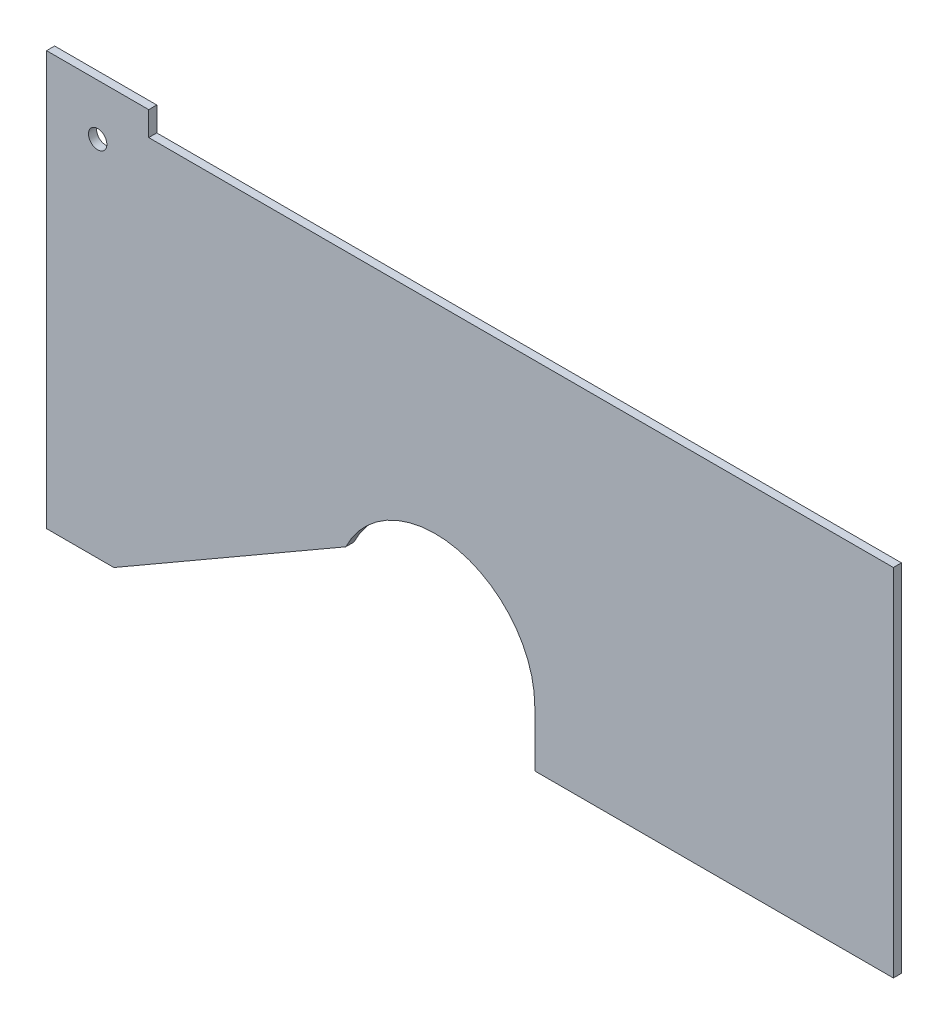
ISO-10303-21;
HEADER;
FILE_DESCRIPTION(('STEP AP214'),'2;1');
FILE_NAME('part.step','',(''),(''),'','','');
FILE_SCHEMA(('AUTOMOTIVE_DESIGN { 1 0 10303 214 1 1 1 1 }'));
ENDSEC;
DATA;
#1=APPLICATION_CONTEXT('core data for automotive mechanical design processes');
#2=APPLICATION_PROTOCOL_DEFINITION('international standard','automotive_design',2000,#1);
#3=PRODUCT_CONTEXT('',#1,'mechanical');
#4=PRODUCT('Part','Part','',(#3));
#5=PRODUCT_RELATED_PRODUCT_CATEGORY('part','',(#4));
#6=PRODUCT_DEFINITION_FORMATION('','',#4);
#7=PRODUCT_DEFINITION_CONTEXT('part definition',#1,'design');
#8=PRODUCT_DEFINITION('design','',#6,#7);
#9=PRODUCT_DEFINITION_SHAPE('','',#8);
#10=(LENGTH_UNIT() NAMED_UNIT(*) SI_UNIT(.MILLI.,.METRE.));
#11=(NAMED_UNIT(*) PLANE_ANGLE_UNIT() SI_UNIT($,.RADIAN.));
#12=(NAMED_UNIT(*) SI_UNIT($,.STERADIAN.) SOLID_ANGLE_UNIT());
#13=UNCERTAINTY_MEASURE_WITH_UNIT(LENGTH_MEASURE(1.E-05),#10,'distance_accuracy_value','');
#14=(GEOMETRIC_REPRESENTATION_CONTEXT(3) GLOBAL_UNCERTAINTY_ASSIGNED_CONTEXT((#13)) GLOBAL_UNIT_ASSIGNED_CONTEXT((#10,
#11,#12)) REPRESENTATION_CONTEXT('',''));
#15=CARTESIAN_POINT('',(0.,0.,0.));
#16=DIRECTION('',(0.,0.,1.));
#17=DIRECTION('',(1.,0.,0.));
#18=AXIS2_PLACEMENT_3D('',#15,#16,#17);
#19=CARTESIAN_POINT('',(144.6,33.7,3.));
#20=DIRECTION('',(0.,0.,1.));
#21=DIRECTION('',(1.,0.,0.));
#22=AXIS2_PLACEMENT_3D('',#19,#20,#21);
#23=PLANE('',#22);
#24=DIRECTION('',(-1.,0.,0.));
#25=VECTOR('',#24,1.);
#26=CARTESIAN_POINT('',(181.6,12.75,3.));
#27=LINE('',#26,#25);
#28=CARTESIAN_POINT('',(315.,12.75,3.));
#29=VERTEX_POINT('',#28);
#30=CARTESIAN_POINT('',(181.6,12.75,3.));
#31=VERTEX_POINT('',#30);
#32=EDGE_CURVE('E215',#29,#31,#27,.T.);
#33=ORIENTED_EDGE('',*,*,#32,.F.);
#34=DIRECTION('',(0.,1.,0.));
#35=VECTOR('',#34,1.);
#36=CARTESIAN_POINT('',(315.,0.,3.));
#37=LINE('',#36,#35);
#38=CARTESIAN_POINT('',(315.,145.,3.));
#39=VERTEX_POINT('',#38);
#40=EDGE_CURVE('E125',#29,#39,#37,.T.);
#41=ORIENTED_EDGE('',*,*,#40,.T.);
#42=DIRECTION('',(-1.,0.,0.));
#43=VECTOR('',#42,1.);
#44=CARTESIAN_POINT('',(38.,145.,3.));
#45=LINE('',#44,#43);
#46=CARTESIAN_POINT('',(38.,145.,3.));
#47=VERTEX_POINT('',#46);
#48=EDGE_CURVE('E117',#39,#47,#45,.T.);
#49=ORIENTED_EDGE('',*,*,#48,.T.);
#50=DIRECTION('',(0.,1.,0.));
#51=VECTOR('',#50,1.);
#52=CARTESIAN_POINT('',(38.,154.,3.));
#53=LINE('',#52,#51);
#54=CARTESIAN_POINT('',(38.,154.,3.));
#55=VERTEX_POINT('',#54);
#56=EDGE_CURVE('E122',#47,#55,#53,.T.);
#57=ORIENTED_EDGE('',*,*,#56,.T.);
#58=DIRECTION('',(-1.,0.,0.));
#59=VECTOR('',#58,1.);
#60=CARTESIAN_POINT('',(19.,154.,3.));
#61=LINE('',#60,#59);
#62=CARTESIAN_POINT('',(0.,154.,3.));
#63=VERTEX_POINT('',#62);
#64=EDGE_CURVE('E61',#55,#63,#61,.T.);
#65=ORIENTED_EDGE('',*,*,#64,.T.);
#66=DIRECTION('',(0.,-1.,0.));
#67=VECTOR('',#66,1.);
#68=CARTESIAN_POINT('',(0.,0.,3.));
#69=LINE('',#68,#67);
#70=CARTESIAN_POINT('',(0.,0.,3.));
#71=VERTEX_POINT('',#70);
#72=EDGE_CURVE('E166',#63,#71,#69,.T.);
#73=ORIENTED_EDGE('',*,*,#72,.T.);
#74=DIRECTION('',(1.,0.,0.));
#75=VECTOR('',#74,1.);
#76=CARTESIAN_POINT('',(0.,0.,3.));
#77=LINE('',#76,#75);
#78=CARTESIAN_POINT('',(25.030359010412,0.,3.));
#79=VERTEX_POINT('',#78);
#80=EDGE_CURVE('E101',#71,#79,#77,.T.);
#81=ORIENTED_EDGE('',*,*,#80,.T.);
#82=DIRECTION('',(0.866025403784438,0.500000000000001,0.));
#83=VECTOR('',#82,1.);
#84=CARTESIAN_POINT('',(25.030359010412,0.,3.));
#85=LINE('',#84,#83);
#86=CARTESIAN_POINT('',(111.286489227342,49.8000000000001,3.));
#87=VERTEX_POINT('',#86);
#88=EDGE_CURVE('E181',#79,#87,#85,.T.);
#89=ORIENTED_EDGE('',*,*,#88,.T.);
#90=CARTESIAN_POINT('',(144.6,33.7,3.));
#91=DIRECTION('',(0.,0.,-1.));
#92=DIRECTION('',(1.,0.,0.));
#93=AXIS2_PLACEMENT_3D('',#90,#91,#92);
#94=CIRCLE('',#93,37.);
#95=CARTESIAN_POINT('',(181.6,33.7,3.));
#96=VERTEX_POINT('',#95);
#97=EDGE_CURVE('E200',#87,#96,#94,.T.);
#98=ORIENTED_EDGE('',*,*,#97,.T.);
#99=DIRECTION('',(0.,-1.,0.));
#100=VECTOR('',#99,1.);
#101=CARTESIAN_POINT('',(181.6,33.7,3.));
#102=LINE('',#101,#100);
#103=EDGE_CURVE('E198',#96,#31,#102,.T.);
#104=ORIENTED_EDGE('',*,*,#103,.T.);
#105=EDGE_LOOP('',(#33,#41,#49,#57,#65,#73,#81,#89,#98,#104));
#106=FACE_BOUND('',#105,.T.);
#107=CARTESIAN_POINT('',(19.,135.,3.));
#108=DIRECTION('',(0.,0.,1.));
#109=DIRECTION('',(1.,0.,0.));
#110=AXIS2_PLACEMENT_3D('',#107,#108,#109);
#111=CIRCLE('',#110,3.425);
#112=CARTESIAN_POINT('',(22.425,135.,3.));
#113=VERTEX_POINT('',#112);
#114=EDGE_CURVE('E151',#113,#113,#111,.T.);
#115=ORIENTED_EDGE('',*,*,#114,.F.);
#116=EDGE_LOOP('',(#115));
#117=FACE_BOUND('',#116,.T.);
#118=ADVANCED_FACE('F37',(#106,#117),#23,.T.);
#119=CARTESIAN_POINT('',(144.6,33.7,0.));
#120=DIRECTION('',(0.,0.,1.));
#121=DIRECTION('',(1.,0.,0.));
#122=AXIS2_PLACEMENT_3D('',#119,#120,#121);
#123=PLANE('',#122);
#124=DIRECTION('',(0.,1.,0.));
#125=VECTOR('',#124,1.);
#126=CARTESIAN_POINT('',(315.,0.,0.));
#127=LINE('',#126,#125);
#128=CARTESIAN_POINT('',(315.,12.75,0.));
#129=VERTEX_POINT('',#128);
#130=CARTESIAN_POINT('',(315.,145.,0.));
#131=VERTEX_POINT('',#130);
#132=EDGE_CURVE('E160',#129,#131,#127,.T.);
#133=ORIENTED_EDGE('',*,*,#132,.F.);
#134=DIRECTION('',(-1.,0.,0.));
#135=VECTOR('',#134,1.);
#136=CARTESIAN_POINT('',(181.6,12.75,0.));
#137=LINE('',#136,#135);
#138=CARTESIAN_POINT('',(181.6,12.75,0.));
#139=VERTEX_POINT('',#138);
#140=EDGE_CURVE('E52',#129,#139,#137,.T.);
#141=ORIENTED_EDGE('',*,*,#140,.T.);
#142=DIRECTION('',(0.,-1.,0.));
#143=VECTOR('',#142,1.);
#144=CARTESIAN_POINT('',(181.6,33.7,0.));
#145=LINE('',#144,#143);
#146=CARTESIAN_POINT('',(181.6,33.7,0.));
#147=VERTEX_POINT('',#146);
#148=EDGE_CURVE('E157',#147,#139,#145,.T.);
#149=ORIENTED_EDGE('',*,*,#148,.F.);
#150=CARTESIAN_POINT('',(144.6,33.7,0.));
#151=DIRECTION('',(0.,0.,-1.));
#152=DIRECTION('',(1.,0.,0.));
#153=AXIS2_PLACEMENT_3D('',#150,#151,#152);
#154=CIRCLE('',#153,37.);
#155=CARTESIAN_POINT('',(111.286489227342,49.8000000000001,0.));
#156=VERTEX_POINT('',#155);
#157=EDGE_CURVE('E155',#156,#147,#154,.T.);
#158=ORIENTED_EDGE('',*,*,#157,.F.);
#159=DIRECTION('',(0.866025403784438,0.500000000000001,0.));
#160=VECTOR('',#159,1.);
#161=CARTESIAN_POINT('',(25.030359010412,0.,0.));
#162=LINE('',#161,#160);
#163=CARTESIAN_POINT('',(25.030359010412,0.,0.));
#164=VERTEX_POINT('',#163);
#165=EDGE_CURVE('E153',#164,#156,#162,.T.);
#166=ORIENTED_EDGE('',*,*,#165,.F.);
#167=DIRECTION('',(1.,0.,0.));
#168=VECTOR('',#167,1.);
#169=CARTESIAN_POINT('',(0.,0.,0.));
#170=LINE('',#169,#168);
#171=CARTESIAN_POINT('',(0.,0.,0.));
#172=VERTEX_POINT('',#171);
#173=EDGE_CURVE('E150',#172,#164,#170,.T.);
#174=ORIENTED_EDGE('',*,*,#173,.F.);
#175=DIRECTION('',(0.,-1.,0.));
#176=VECTOR('',#175,1.);
#177=CARTESIAN_POINT('',(0.,0.,0.));
#178=LINE('',#177,#176);
#179=CARTESIAN_POINT('',(0.,154.,0.));
#180=VERTEX_POINT('',#179);
#181=EDGE_CURVE('E147',#180,#172,#178,.T.);
#182=ORIENTED_EDGE('',*,*,#181,.F.);
#183=DIRECTION('',(-1.,0.,0.));
#184=VECTOR('',#183,1.);
#185=CARTESIAN_POINT('',(0.,154.,0.));
#186=LINE('',#185,#184);
#187=CARTESIAN_POINT('',(38.,154.,0.));
#188=VERTEX_POINT('',#187);
#189=EDGE_CURVE('E93',#188,#180,#186,.T.);
#190=ORIENTED_EDGE('',*,*,#189,.F.);
#191=DIRECTION('',(0.,1.,0.));
#192=VECTOR('',#191,1.);
#193=CARTESIAN_POINT('',(38.,154.,0.));
#194=LINE('',#193,#192);
#195=CARTESIAN_POINT('',(38.,145.,0.));
#196=VERTEX_POINT('',#195);
#197=EDGE_CURVE('E163',#196,#188,#194,.T.);
#198=ORIENTED_EDGE('',*,*,#197,.F.);
#199=DIRECTION('',(-1.,0.,0.));
#200=VECTOR('',#199,1.);
#201=CARTESIAN_POINT('',(38.,145.,0.));
#202=LINE('',#201,#200);
#203=EDGE_CURVE('E134',#131,#196,#202,.T.);
#204=ORIENTED_EDGE('',*,*,#203,.F.);
#205=EDGE_LOOP('',(#133,#141,#149,#158,#166,#174,#182,#190,#198,#204));
#206=FACE_BOUND('',#205,.T.);
#207=CARTESIAN_POINT('',(19.,135.,0.));
#208=DIRECTION('',(0.,0.,1.));
#209=DIRECTION('',(1.,0.,0.));
#210=AXIS2_PLACEMENT_3D('',#207,#208,#209);
#211=CIRCLE('',#210,3.425);
#212=CARTESIAN_POINT('',(22.425,135.,0.));
#213=VERTEX_POINT('',#212);
#214=EDGE_CURVE('E207',#213,#213,#211,.T.);
#215=ORIENTED_EDGE('',*,*,#214,.T.);
#216=EDGE_LOOP('',(#215));
#217=FACE_BOUND('',#216,.T.);
#218=ADVANCED_FACE('F185',(#206,#217),#123,.F.);
#219=CARTESIAN_POINT('',(0.,0.,3.));
#220=DIRECTION('',(1.,0.,0.));
#221=DIRECTION('',(0.,0.,-1.));
#222=AXIS2_PLACEMENT_3D('',#219,#220,#221);
#223=PLANE('',#222);
#224=ORIENTED_EDGE('',*,*,#181,.T.);
#225=DIRECTION('',(0.,0.,-1.));
#226=VECTOR('',#225,1.);
#227=CARTESIAN_POINT('',(0.,0.,3.));
#228=LINE('',#227,#226);
#229=EDGE_CURVE('E11',#71,#172,#228,.T.);
#230=ORIENTED_EDGE('',*,*,#229,.F.);
#231=ORIENTED_EDGE('',*,*,#72,.F.);
#232=DIRECTION('',(0.,0.,-1.));
#233=VECTOR('',#232,1.);
#234=CARTESIAN_POINT('',(0.,154.,3.));
#235=LINE('',#234,#233);
#236=EDGE_CURVE('E143',#63,#180,#235,.T.);
#237=ORIENTED_EDGE('',*,*,#236,.T.);
#238=EDGE_LOOP('',(#224,#230,#231,#237));
#239=FACE_BOUND('',#238,.T.);
#240=ADVANCED_FACE('F39',(#239),#223,.F.);
#241=CARTESIAN_POINT('',(0.,0.,3.));
#242=DIRECTION('',(0.,1.,0.));
#243=DIRECTION('',(0.,0.,1.));
#244=AXIS2_PLACEMENT_3D('',#241,#242,#243);
#245=PLANE('',#244);
#246=ORIENTED_EDGE('',*,*,#173,.T.);
#247=DIRECTION('',(0.,0.,-1.));
#248=VECTOR('',#247,1.);
#249=CARTESIAN_POINT('',(25.030359010412,0.,3.));
#250=LINE('',#249,#248);
#251=EDGE_CURVE('E45',#79,#164,#250,.T.);
#252=ORIENTED_EDGE('',*,*,#251,.F.);
#253=ORIENTED_EDGE('',*,*,#80,.F.);
#254=ORIENTED_EDGE('',*,*,#229,.T.);
#255=EDGE_LOOP('',(#246,#252,#253,#254));
#256=FACE_BOUND('',#255,.T.);
#257=ADVANCED_FACE('F227',(#256),#245,.F.);
#258=CARTESIAN_POINT('',(25.030359010412,0.,3.));
#259=DIRECTION('',(-0.500000000000001,0.866025403784438,0.));
#260=DIRECTION('',(-0.866025403784438,-0.500000000000001,0.));
#261=AXIS2_PLACEMENT_3D('',#258,#259,#260);
#262=PLANE('',#261);
#263=ORIENTED_EDGE('',*,*,#165,.T.);
#264=DIRECTION('',(0.,0.,-1.));
#265=VECTOR('',#264,1.);
#266=CARTESIAN_POINT('',(111.286489227342,49.8000000000001,3.));
#267=LINE('',#266,#265);
#268=EDGE_CURVE('E173',#87,#156,#267,.T.);
#269=ORIENTED_EDGE('',*,*,#268,.F.);
#270=ORIENTED_EDGE('',*,*,#88,.F.);
#271=ORIENTED_EDGE('',*,*,#251,.T.);
#272=EDGE_LOOP('',(#263,#269,#270,#271));
#273=FACE_BOUND('',#272,.T.);
#274=ADVANCED_FACE('F179',(#273),#262,.F.);
#275=CARTESIAN_POINT('',(144.6,33.7,3.));
#276=DIRECTION('',(0.,0.,-1.));
#277=DIRECTION('',(-1.,0.,0.));
#278=AXIS2_PLACEMENT_3D('',#275,#276,#277);
#279=CYLINDRICAL_SURFACE('',#278,37.);
#280=ORIENTED_EDGE('',*,*,#157,.T.);
#281=DIRECTION('',(0.,0.,-1.));
#282=VECTOR('',#281,1.);
#283=CARTESIAN_POINT('',(181.6,33.7,3.));
#284=LINE('',#283,#282);
#285=EDGE_CURVE('E170',#96,#147,#284,.T.);
#286=ORIENTED_EDGE('',*,*,#285,.F.);
#287=ORIENTED_EDGE('',*,*,#97,.F.);
#288=ORIENTED_EDGE('',*,*,#268,.T.);
#289=EDGE_LOOP('',(#280,#286,#287,#288));
#290=FACE_BOUND('',#289,.T.);
#291=ADVANCED_FACE('F191',(#290),#279,.F.);
#292=CARTESIAN_POINT('',(181.6,33.7,3.));
#293=DIRECTION('',(1.,0.,0.));
#294=DIRECTION('',(0.,0.,-1.));
#295=AXIS2_PLACEMENT_3D('',#292,#293,#294);
#296=PLANE('',#295);
#297=ORIENTED_EDGE('',*,*,#148,.T.);
#298=DIRECTION('',(0.,0.,1.));
#299=VECTOR('',#298,1.);
#300=CARTESIAN_POINT('',(181.6,12.75,0.));
#301=LINE('',#300,#299);
#302=EDGE_CURVE('E199',#139,#31,#301,.T.);
#303=ORIENTED_EDGE('',*,*,#302,.T.);
#304=ORIENTED_EDGE('',*,*,#103,.F.);
#305=ORIENTED_EDGE('',*,*,#285,.T.);
#306=EDGE_LOOP('',(#297,#303,#304,#305));
#307=FACE_BOUND('',#306,.T.);
#308=ADVANCED_FACE('F195',(#307),#296,.F.);
#309=CARTESIAN_POINT('',(315.,0.,3.));
#310=DIRECTION('',(-1.,0.,0.));
#311=DIRECTION('',(0.,0.,1.));
#312=AXIS2_PLACEMENT_3D('',#309,#310,#311);
#313=PLANE('',#312);
#314=ORIENTED_EDGE('',*,*,#40,.F.);
#315=DIRECTION('',(0.,0.,1.));
#316=VECTOR('',#315,1.);
#317=CARTESIAN_POINT('',(315.,12.75,0.));
#318=LINE('',#317,#316);
#319=EDGE_CURVE('E212',#129,#29,#318,.T.);
#320=ORIENTED_EDGE('',*,*,#319,.F.);
#321=ORIENTED_EDGE('',*,*,#132,.T.);
#322=DIRECTION('',(0.,0.,-1.));
#323=VECTOR('',#322,1.);
#324=CARTESIAN_POINT('',(315.,145.,3.));
#325=LINE('',#324,#323);
#326=EDGE_CURVE('E138',#39,#131,#325,.T.);
#327=ORIENTED_EDGE('',*,*,#326,.F.);
#328=EDGE_LOOP('',(#314,#320,#321,#327));
#329=FACE_BOUND('',#328,.T.);
#330=ADVANCED_FACE('F222',(#329),#313,.F.);
#331=CARTESIAN_POINT('',(38.,145.,3.));
#332=DIRECTION('',(0.,-1.,0.));
#333=DIRECTION('',(0.,0.,-1.));
#334=AXIS2_PLACEMENT_3D('',#331,#332,#333);
#335=PLANE('',#334);
#336=ORIENTED_EDGE('',*,*,#203,.T.);
#337=DIRECTION('',(0.,0.,-1.));
#338=VECTOR('',#337,1.);
#339=CARTESIAN_POINT('',(38.,145.,3.));
#340=LINE('',#339,#338);
#341=EDGE_CURVE('E131',#47,#196,#340,.T.);
#342=ORIENTED_EDGE('',*,*,#341,.F.);
#343=ORIENTED_EDGE('',*,*,#48,.F.);
#344=ORIENTED_EDGE('',*,*,#326,.T.);
#345=EDGE_LOOP('',(#336,#342,#343,#344));
#346=FACE_BOUND('',#345,.T.);
#347=ADVANCED_FACE('F132',(#346),#335,.F.);
#348=CARTESIAN_POINT('',(38.,154.,3.));
#349=DIRECTION('',(-1.,0.,0.));
#350=DIRECTION('',(0.,0.,1.));
#351=AXIS2_PLACEMENT_3D('',#348,#349,#350);
#352=PLANE('',#351);
#353=ORIENTED_EDGE('',*,*,#197,.T.);
#354=DIRECTION('',(0.,0.,-1.));
#355=VECTOR('',#354,1.);
#356=CARTESIAN_POINT('',(38.,154.,3.));
#357=LINE('',#356,#355);
#358=EDGE_CURVE('E139',#55,#188,#357,.T.);
#359=ORIENTED_EDGE('',*,*,#358,.F.);
#360=ORIENTED_EDGE('',*,*,#56,.F.);
#361=ORIENTED_EDGE('',*,*,#341,.T.);
#362=EDGE_LOOP('',(#353,#359,#360,#361));
#363=FACE_BOUND('',#362,.T.);
#364=ADVANCED_FACE('F141',(#363),#352,.F.);
#365=CARTESIAN_POINT('',(0.,154.,3.));
#366=DIRECTION('',(0.,-1.,0.));
#367=DIRECTION('',(0.,0.,-1.));
#368=AXIS2_PLACEMENT_3D('',#365,#366,#367);
#369=PLANE('',#368);
#370=ORIENTED_EDGE('',*,*,#189,.T.);
#371=ORIENTED_EDGE('',*,*,#236,.F.);
#372=ORIENTED_EDGE('',*,*,#64,.F.);
#373=ORIENTED_EDGE('',*,*,#358,.T.);
#374=EDGE_LOOP('',(#370,#371,#372,#373));
#375=FACE_BOUND('',#374,.T.);
#376=ADVANCED_FACE('F223',(#375),#369,.F.);
#377=CARTESIAN_POINT('',(19.,135.,3.));
#378=DIRECTION('',(0.,0.,-1.));
#379=DIRECTION('',(-1.,0.,0.));
#380=AXIS2_PLACEMENT_3D('',#377,#378,#379);
#381=CYLINDRICAL_SURFACE('',#380,3.425);
#382=ORIENTED_EDGE('',*,*,#114,.T.);
#383=EDGE_LOOP('',(#382));
#384=FACE_BOUND('',#383,.T.);
#385=ORIENTED_EDGE('',*,*,#214,.F.);
#386=EDGE_LOOP('',(#385));
#387=FACE_BOUND('',#386,.T.);
#388=ADVANCED_FACE('F241',(#384,#387),#381,.F.);
#389=CARTESIAN_POINT('',(181.6,12.75,0.));
#390=DIRECTION('',(0.,1.,0.));
#391=DIRECTION('',(0.,0.,1.));
#392=AXIS2_PLACEMENT_3D('',#389,#390,#391);
#393=PLANE('',#392);
#394=ORIENTED_EDGE('',*,*,#32,.T.);
#395=ORIENTED_EDGE('',*,*,#302,.F.);
#396=ORIENTED_EDGE('',*,*,#140,.F.);
#397=ORIENTED_EDGE('',*,*,#319,.T.);
#398=EDGE_LOOP('',(#394,#395,#396,#397));
#399=FACE_BOUND('',#398,.T.);
#400=ADVANCED_FACE('F220',(#399),#393,.F.);
#401=CLOSED_SHELL('',(#118,#218,#240,#257,#274,#291,#308,#330,#347,#364,#376,#388,#400));
#402=MANIFOLD_SOLID_BREP('B2',#401);
#403=ADVANCED_BREP_SHAPE_REPRESENTATION('',(#18,#402),#14);
#404=SHAPE_DEFINITION_REPRESENTATION(#9,#403);
ENDSEC;
END-ISO-10303-21;
